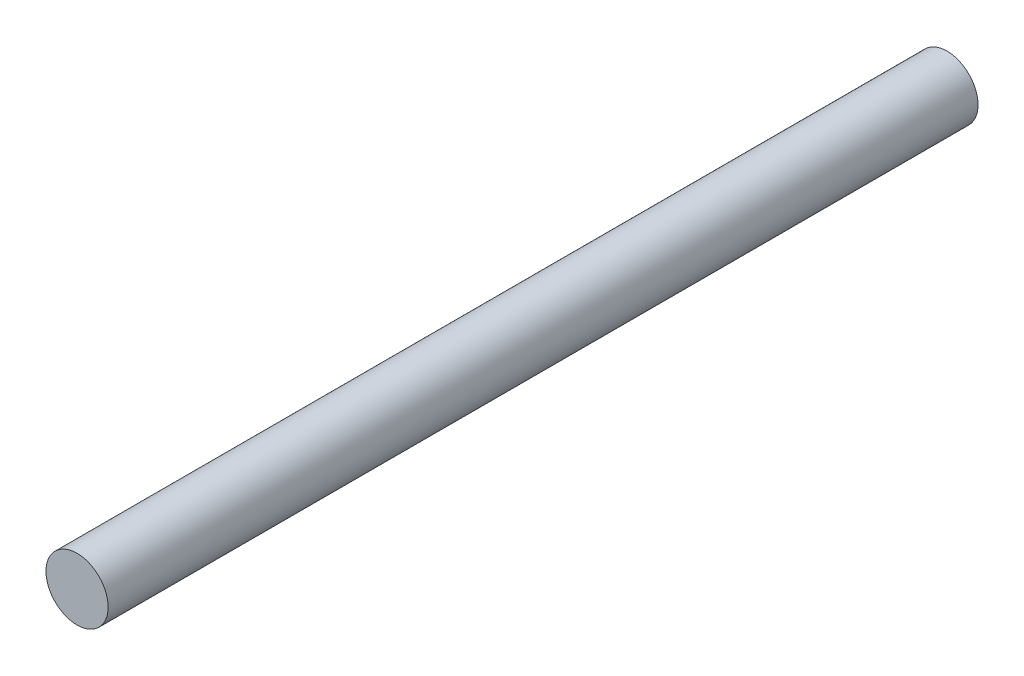
ISO-10303-21;
HEADER;
FILE_DESCRIPTION(('STEP AP214'),'2;1');
FILE_NAME('part.step','',(''),(''),'','','');
FILE_SCHEMA(('AUTOMOTIVE_DESIGN { 1 0 10303 214 1 1 1 1 }'));
ENDSEC;
DATA;
#1=APPLICATION_CONTEXT('core data for automotive mechanical design processes');
#2=APPLICATION_PROTOCOL_DEFINITION('international standard','automotive_design',2000,#1);
#3=PRODUCT_CONTEXT('',#1,'mechanical');
#4=PRODUCT('Part','Part','',(#3));
#5=PRODUCT_RELATED_PRODUCT_CATEGORY('part','',(#4));
#6=PRODUCT_DEFINITION_FORMATION('','',#4);
#7=PRODUCT_DEFINITION_CONTEXT('part definition',#1,'design');
#8=PRODUCT_DEFINITION('design','',#6,#7);
#9=PRODUCT_DEFINITION_SHAPE('','',#8);
#10=(LENGTH_UNIT() NAMED_UNIT(*) SI_UNIT(.MILLI.,.METRE.));
#11=(NAMED_UNIT(*) PLANE_ANGLE_UNIT() SI_UNIT($,.RADIAN.));
#12=(NAMED_UNIT(*) SI_UNIT($,.STERADIAN.) SOLID_ANGLE_UNIT());
#13=UNCERTAINTY_MEASURE_WITH_UNIT(LENGTH_MEASURE(1.E-05),#10,'distance_accuracy_value','');
#14=(GEOMETRIC_REPRESENTATION_CONTEXT(3) GLOBAL_UNCERTAINTY_ASSIGNED_CONTEXT((#13)) GLOBAL_UNIT_ASSIGNED_CONTEXT((#10,
#11,#12)) REPRESENTATION_CONTEXT('',''));
#15=CARTESIAN_POINT('',(0.,0.,0.));
#16=DIRECTION('',(0.,0.,1.));
#17=DIRECTION('',(1.,0.,0.));
#18=AXIS2_PLACEMENT_3D('',#15,#16,#17);
#19=CARTESIAN_POINT('',(0.,0.,210.));
#20=DIRECTION('',(0.,0.,-1.));
#21=DIRECTION('',(-1.,0.,0.));
#22=AXIS2_PLACEMENT_3D('',#19,#20,#21);
#23=CYLINDRICAL_SURFACE('',#22,7.5);
#24=CARTESIAN_POINT('',(0.,0.,210.));
#25=DIRECTION('',(0.,0.,1.));
#26=DIRECTION('',(1.,0.,0.));
#27=AXIS2_PLACEMENT_3D('',#24,#25,#26);
#28=CIRCLE('',#27,7.5);
#29=CARTESIAN_POINT('',(-7.5,0.,210.));
#30=VERTEX_POINT('',#29);
#31=EDGE_CURVE('E12',#30,#30,#28,.T.);
#32=CARTESIAN_POINT('',(0.,0.,0.));
#33=DIRECTION('',(0.,0.,1.));
#34=DIRECTION('',(1.,0.,0.));
#35=AXIS2_PLACEMENT_3D('',#32,#33,#34);
#36=CIRCLE('',#35,7.5);
#37=CARTESIAN_POINT('',(-7.5,0.,0.));
#38=VERTEX_POINT('',#37);
#39=EDGE_CURVE('E43',#38,#38,#36,.T.);
#40=CARTESIAN_POINT('',(-7.5,0.,210.));
#41=CARTESIAN_POINT('',(-7.5,0.,207.8125));
#42=CARTESIAN_POINT('',(-7.5,0.,205.625));
#43=CARTESIAN_POINT('',(-7.5,0.,201.25));
#44=CARTESIAN_POINT('',(-7.5,0.,199.0625));
#45=CARTESIAN_POINT('',(-7.5,0.,194.6875));
#46=CARTESIAN_POINT('',(-7.5,0.,192.5));
#47=CARTESIAN_POINT('',(-7.5,0.,188.125));
#48=CARTESIAN_POINT('',(-7.5,0.,185.9375));
#49=CARTESIAN_POINT('',(-7.5,0.,181.5625));
#50=CARTESIAN_POINT('',(-7.5,0.,179.375));
#51=CARTESIAN_POINT('',(-7.5,0.,175.));
#52=CARTESIAN_POINT('',(-7.5,0.,172.8125));
#53=CARTESIAN_POINT('',(-7.5,0.,168.4375));
#54=CARTESIAN_POINT('',(-7.5,0.,166.25));
#55=CARTESIAN_POINT('',(-7.5,0.,161.875));
#56=CARTESIAN_POINT('',(-7.5,0.,159.6875));
#57=CARTESIAN_POINT('',(-7.5,0.,155.3125));
#58=CARTESIAN_POINT('',(-7.5,0.,153.125));
#59=CARTESIAN_POINT('',(-7.5,0.,148.75));
#60=CARTESIAN_POINT('',(-7.5,0.,146.5625));
#61=CARTESIAN_POINT('',(-7.5,0.,142.1875));
#62=CARTESIAN_POINT('',(-7.5,0.,140.));
#63=CARTESIAN_POINT('',(-7.5,0.,135.625));
#64=CARTESIAN_POINT('',(-7.5,0.,133.4375));
#65=CARTESIAN_POINT('',(-7.5,0.,129.0625));
#66=CARTESIAN_POINT('',(-7.5,0.,126.875));
#67=CARTESIAN_POINT('',(-7.5,0.,122.5));
#68=CARTESIAN_POINT('',(-7.5,0.,120.3125));
#69=CARTESIAN_POINT('',(-7.5,0.,115.9375));
#70=CARTESIAN_POINT('',(-7.5,0.,113.75));
#71=CARTESIAN_POINT('',(-7.5,0.,109.375));
#72=CARTESIAN_POINT('',(-7.5,0.,107.1875));
#73=CARTESIAN_POINT('',(-7.5,0.,102.8125));
#74=CARTESIAN_POINT('',(-7.5,0.,100.625));
#75=CARTESIAN_POINT('',(-7.5,0.,96.25));
#76=CARTESIAN_POINT('',(-7.5,0.,94.0625));
#77=CARTESIAN_POINT('',(-7.5,0.,89.6875));
#78=CARTESIAN_POINT('',(-7.5,0.,87.5));
#79=CARTESIAN_POINT('',(-7.5,0.,83.125));
#80=CARTESIAN_POINT('',(-7.5,0.,80.9375));
#81=CARTESIAN_POINT('',(-7.5,0.,76.5625));
#82=CARTESIAN_POINT('',(-7.5,0.,74.375));
#83=CARTESIAN_POINT('',(-7.5,0.,70.));
#84=CARTESIAN_POINT('',(-7.5,0.,67.8125));
#85=CARTESIAN_POINT('',(-7.5,0.,63.4375));
#86=CARTESIAN_POINT('',(-7.5,0.,61.25));
#87=CARTESIAN_POINT('',(-7.5,0.,56.875));
#88=CARTESIAN_POINT('',(-7.5,0.,54.6875));
#89=CARTESIAN_POINT('',(-7.5,0.,50.3125));
#90=CARTESIAN_POINT('',(-7.5,0.,48.125));
#91=CARTESIAN_POINT('',(-7.5,0.,43.75));
#92=CARTESIAN_POINT('',(-7.5,0.,41.5625));
#93=CARTESIAN_POINT('',(-7.5,0.,37.1875));
#94=CARTESIAN_POINT('',(-7.5,0.,35.));
#95=CARTESIAN_POINT('',(-7.5,0.,30.625));
#96=CARTESIAN_POINT('',(-7.5,0.,28.4375));
#97=CARTESIAN_POINT('',(-7.5,0.,24.0625));
#98=CARTESIAN_POINT('',(-7.5,0.,21.875));
#99=CARTESIAN_POINT('',(-7.5,0.,17.5));
#100=CARTESIAN_POINT('',(-7.5,0.,15.3125));
#101=CARTESIAN_POINT('',(-7.5,0.,10.9375));
#102=CARTESIAN_POINT('',(-7.5,0.,8.75000000000002));
#103=CARTESIAN_POINT('',(-7.5,0.,4.37500000000003));
#104=CARTESIAN_POINT('',(-7.5,0.,2.18750000000003));
#105=CARTESIAN_POINT('',(-7.5,0.,0.));
#106=B_SPLINE_CURVE_WITH_KNOTS('',3,(#40,#41,#42,#43,#44,#45,#46,#47,#48,#49,#50,#51,#52,#53,
#54,#55,#56,#57,#58,#59,#60,#61,#62,#63,#64,#65,#66,#67,#68,#69,#70,#71,#72,#73,#74,#75,#76,#77,
#78,#79,#80,#81,#82,#83,#84,#85,#86,#87,#88,#89,#90,#91,#92,#93,#94,#95,#96,#97,#98,#99,#100,
#101,#102,#103,#104,#105),.UNSPECIFIED.,.F.,.F.,(4,2,2,2,2,2,2,2,2,2,2,2,2,2,2,2,2,2,2,2,2,2,2,
2,2,2,2,2,2,2,2,2,4),(0.,6.56249999999997,13.125,19.6875,26.25,32.8125,39.375,45.9375,52.5,
59.0625,65.625,72.1875,78.75,85.3125,91.875,98.4374999999999,105.,111.5625,118.125,124.6875,
131.25,137.8125,144.375,150.9375,157.5,164.0625,170.625,177.1875,183.75,190.3125,196.875,
203.4375,210.),.UNSPECIFIED.);
#107=EDGE_CURVE('BSEAM40',#30,#38,#106,.T.);
#108=ORIENTED_EDGE('',*,*,#31,.F.);
#109=ORIENTED_EDGE('',*,*,#39,.T.);
#110=ORIENTED_EDGE('',*,*,#107,.T.);
#111=ORIENTED_EDGE('',*,*,#107,.F.);
#112=EDGE_LOOP('',(#108,#110,#109,#111));
#113=FACE_BOUND('',#112,.T.);
#114=ADVANCED_FACE('F40',(#113),#23,.T.);
#115=CARTESIAN_POINT('',(0.,0.,210.));
#116=DIRECTION('',(0.,0.,1.));
#117=DIRECTION('',(1.,0.,0.));
#118=AXIS2_PLACEMENT_3D('',#115,#116,#117);
#119=PLANE('',#118);
#120=ORIENTED_EDGE('',*,*,#31,.T.);
#121=EDGE_LOOP('',(#120));
#122=FACE_BOUND('',#121,.T.);
#123=ADVANCED_FACE('F55',(#122),#119,.T.);
#124=CARTESIAN_POINT('',(0.,0.,0.));
#125=DIRECTION('',(0.,0.,1.));
#126=DIRECTION('',(1.,0.,0.));
#127=AXIS2_PLACEMENT_3D('',#124,#125,#126);
#128=PLANE('',#127);
#129=ORIENTED_EDGE('',*,*,#39,.F.);
#130=EDGE_LOOP('',(#129));
#131=FACE_BOUND('',#130,.T.);
#132=ADVANCED_FACE('F53',(#131),#128,.F.);
#133=CLOSED_SHELL('',(#114,#123,#132));
#134=MANIFOLD_SOLID_BREP('B2',#133);
#135=ADVANCED_BREP_SHAPE_REPRESENTATION('',(#18,#134),#14);
#136=SHAPE_DEFINITION_REPRESENTATION(#9,#135);
ENDSEC;
END-ISO-10303-21;
